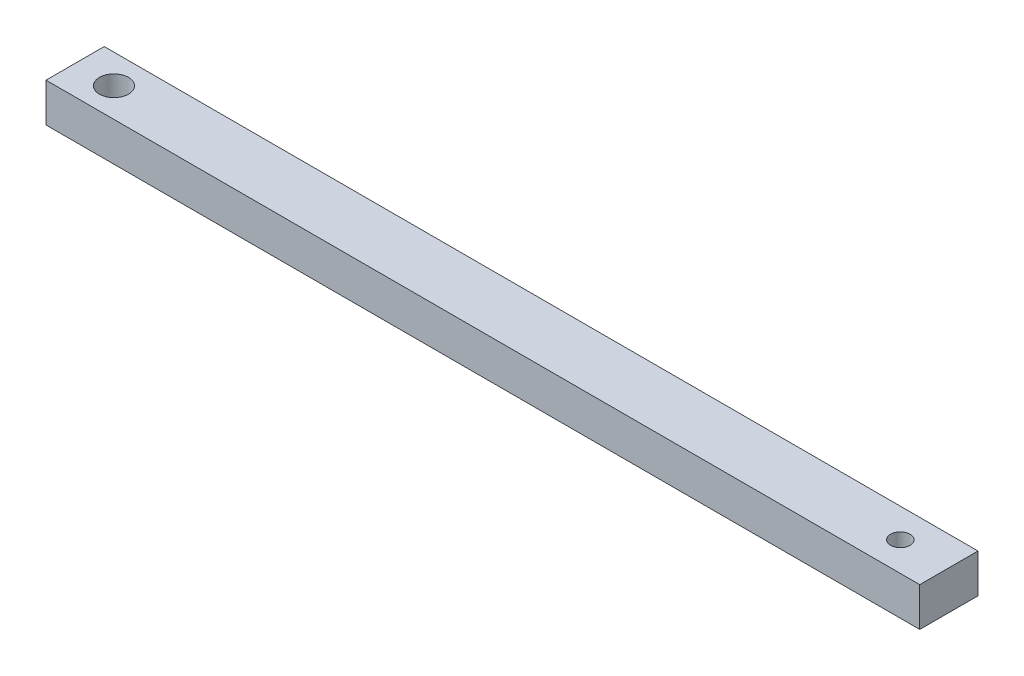
ISO-10303-21;
HEADER;
FILE_DESCRIPTION(('STEP AP214'),'2;1');
FILE_NAME('part.step','',(''),(''),'','','');
FILE_SCHEMA(('AUTOMOTIVE_DESIGN { 1 0 10303 214 1 1 1 1 }'));
ENDSEC;
DATA;
#1=APPLICATION_CONTEXT('core data for automotive mechanical design processes');
#2=APPLICATION_PROTOCOL_DEFINITION('international standard','automotive_design',2000,#1);
#3=PRODUCT_CONTEXT('',#1,'mechanical');
#4=PRODUCT('Part','Part','',(#3));
#5=PRODUCT_RELATED_PRODUCT_CATEGORY('part','',(#4));
#6=PRODUCT_DEFINITION_FORMATION('','',#4);
#7=PRODUCT_DEFINITION_CONTEXT('part definition',#1,'design');
#8=PRODUCT_DEFINITION('design','',#6,#7);
#9=PRODUCT_DEFINITION_SHAPE('','',#8);
#10=(LENGTH_UNIT() NAMED_UNIT(*) SI_UNIT(.MILLI.,.METRE.));
#11=(NAMED_UNIT(*) PLANE_ANGLE_UNIT() SI_UNIT($,.RADIAN.));
#12=(NAMED_UNIT(*) SI_UNIT($,.STERADIAN.) SOLID_ANGLE_UNIT());
#13=UNCERTAINTY_MEASURE_WITH_UNIT(LENGTH_MEASURE(1.E-05),#10,'distance_accuracy_value','');
#14=(GEOMETRIC_REPRESENTATION_CONTEXT(3) GLOBAL_UNCERTAINTY_ASSIGNED_CONTEXT((#13)) GLOBAL_UNIT_ASSIGNED_CONTEXT((#10,
#11,#12)) REPRESENTATION_CONTEXT('',''));
#15=CARTESIAN_POINT('',(0.,0.,0.));
#16=DIRECTION('',(0.,0.,1.));
#17=DIRECTION('',(1.,0.,0.));
#18=AXIS2_PLACEMENT_3D('',#15,#16,#17);
#19=CARTESIAN_POINT('',(225.,10.,30.));
#20=DIRECTION('',(-1.,0.,0.));
#21=DIRECTION('',(0.,0.,1.));
#22=AXIS2_PLACEMENT_3D('',#19,#20,#21);
#23=PLANE('',#22);
#24=DIRECTION('',(0.,1.,0.));
#25=VECTOR('',#24,1.);
#26=CARTESIAN_POINT('',(225.,10.,0.));
#27=LINE('',#26,#25);
#28=CARTESIAN_POINT('',(225.,-10.,0.));
#29=VERTEX_POINT('',#28);
#30=CARTESIAN_POINT('',(225.,10.,0.));
#31=VERTEX_POINT('',#30);
#32=EDGE_CURVE('E104',#29,#31,#27,.T.);
#33=ORIENTED_EDGE('',*,*,#32,.T.);
#34=DIRECTION('',(0.,0.,-1.));
#35=VECTOR('',#34,1.);
#36=CARTESIAN_POINT('',(225.,10.,30.));
#37=LINE('',#36,#35);
#38=CARTESIAN_POINT('',(225.,10.,30.));
#39=VERTEX_POINT('',#38);
#40=EDGE_CURVE('E11',#39,#31,#37,.T.);
#41=ORIENTED_EDGE('',*,*,#40,.F.);
#42=DIRECTION('',(0.,1.,0.));
#43=VECTOR('',#42,1.);
#44=CARTESIAN_POINT('',(225.,10.,30.));
#45=LINE('',#44,#43);
#46=CARTESIAN_POINT('',(225.,-10.,30.));
#47=VERTEX_POINT('',#46);
#48=EDGE_CURVE('E91',#47,#39,#45,.T.);
#49=ORIENTED_EDGE('',*,*,#48,.F.);
#50=DIRECTION('',(0.,0.,-1.));
#51=VECTOR('',#50,1.);
#52=CARTESIAN_POINT('',(225.,-10.,30.));
#53=LINE('',#52,#51);
#54=EDGE_CURVE('E100',#47,#29,#53,.T.);
#55=ORIENTED_EDGE('',*,*,#54,.T.);
#56=EDGE_LOOP('',(#33,#41,#49,#55));
#57=FACE_BOUND('',#56,.T.);
#58=ADVANCED_FACE('F39',(#57),#23,.F.);
#59=CARTESIAN_POINT('',(-225.,10.,30.));
#60=DIRECTION('',(0.,-1.,0.));
#61=DIRECTION('',(0.,0.,-1.));
#62=AXIS2_PLACEMENT_3D('',#59,#60,#61);
#63=PLANE('',#62);
#64=CARTESIAN_POINT('',(200.,10.,15.));
#65=DIRECTION('',(0.,1.,0.));
#66=DIRECTION('',(0.,0.,1.));
#67=AXIS2_PLACEMENT_3D('',#64,#65,#66);
#68=CIRCLE('',#67,4.99999999999999);
#69=CARTESIAN_POINT('',(200.,10.,20.));
#70=VERTEX_POINT('',#69);
#71=EDGE_CURVE('E121',#70,#70,#68,.T.);
#72=ORIENTED_EDGE('',*,*,#71,.F.);
#73=EDGE_LOOP('',(#72));
#74=FACE_BOUND('',#73,.T.);
#75=CARTESIAN_POINT('',(-205.,10.,15.));
#76=DIRECTION('',(0.,1.,0.));
#77=DIRECTION('',(0.,0.,1.));
#78=AXIS2_PLACEMENT_3D('',#75,#76,#77);
#79=CIRCLE('',#78,7.50000000000001);
#80=CARTESIAN_POINT('',(-205.,10.,22.5));
#81=VERTEX_POINT('',#80);
#82=EDGE_CURVE('E117',#81,#81,#79,.T.);
#83=ORIENTED_EDGE('',*,*,#82,.F.);
#84=EDGE_LOOP('',(#83));
#85=FACE_BOUND('',#84,.T.);
#86=DIRECTION('',(-1.,0.,0.));
#87=VECTOR('',#86,1.);
#88=CARTESIAN_POINT('',(-225.,10.,0.));
#89=LINE('',#88,#87);
#90=CARTESIAN_POINT('',(-225.,10.,0.));
#91=VERTEX_POINT('',#90);
#92=EDGE_CURVE('E95',#31,#91,#89,.T.);
#93=ORIENTED_EDGE('',*,*,#92,.T.);
#94=DIRECTION('',(0.,0.,-1.));
#95=VECTOR('',#94,1.);
#96=CARTESIAN_POINT('',(-225.,10.,30.));
#97=LINE('',#96,#95);
#98=CARTESIAN_POINT('',(-225.,10.,30.));
#99=VERTEX_POINT('',#98);
#100=EDGE_CURVE('E48',#99,#91,#97,.T.);
#101=ORIENTED_EDGE('',*,*,#100,.F.);
#102=DIRECTION('',(-1.,0.,0.));
#103=VECTOR('',#102,1.);
#104=CARTESIAN_POINT('',(-225.,10.,30.));
#105=LINE('',#104,#103);
#106=EDGE_CURVE('E86',#39,#99,#105,.T.);
#107=ORIENTED_EDGE('',*,*,#106,.F.);
#108=ORIENTED_EDGE('',*,*,#40,.T.);
#109=EDGE_LOOP('',(#93,#101,#107,#108));
#110=FACE_BOUND('',#109,.T.);
#111=ADVANCED_FACE('F94',(#74,#85,#110),#63,.F.);
#112=CARTESIAN_POINT('',(-225.,10.,30.));
#113=DIRECTION('',(1.,0.,0.));
#114=DIRECTION('',(0.,0.,-1.));
#115=AXIS2_PLACEMENT_3D('',#112,#113,#114);
#116=PLANE('',#115);
#117=DIRECTION('',(0.,-1.,0.));
#118=VECTOR('',#117,1.);
#119=CARTESIAN_POINT('',(-225.,10.,0.));
#120=LINE('',#119,#118);
#121=CARTESIAN_POINT('',(-225.,-10.,0.));
#122=VERTEX_POINT('',#121);
#123=EDGE_CURVE('E73',#91,#122,#120,.T.);
#124=ORIENTED_EDGE('',*,*,#123,.T.);
#125=DIRECTION('',(0.,0.,-1.));
#126=VECTOR('',#125,1.);
#127=CARTESIAN_POINT('',(-225.,-10.,30.));
#128=LINE('',#127,#126);
#129=CARTESIAN_POINT('',(-225.,-10.,30.));
#130=VERTEX_POINT('',#129);
#131=EDGE_CURVE('E96',#130,#122,#128,.T.);
#132=ORIENTED_EDGE('',*,*,#131,.F.);
#133=DIRECTION('',(0.,-1.,0.));
#134=VECTOR('',#133,1.);
#135=CARTESIAN_POINT('',(-225.,10.,30.));
#136=LINE('',#135,#134);
#137=EDGE_CURVE('E89',#99,#130,#136,.T.);
#138=ORIENTED_EDGE('',*,*,#137,.F.);
#139=ORIENTED_EDGE('',*,*,#100,.T.);
#140=EDGE_LOOP('',(#124,#132,#138,#139));
#141=FACE_BOUND('',#140,.T.);
#142=ADVANCED_FACE('F98',(#141),#116,.F.);
#143=CARTESIAN_POINT('',(-225.,-10.,30.));
#144=DIRECTION('',(0.,1.,0.));
#145=DIRECTION('',(0.,0.,1.));
#146=AXIS2_PLACEMENT_3D('',#143,#144,#145);
#147=PLANE('',#146);
#148=CARTESIAN_POINT('',(200.,-10.,15.));
#149=DIRECTION('',(0.,1.,0.));
#150=DIRECTION('',(0.,0.,1.));
#151=AXIS2_PLACEMENT_3D('',#148,#149,#150);
#152=CIRCLE('',#151,4.99999999999999);
#153=CARTESIAN_POINT('',(200.,-10.,20.));
#154=VERTEX_POINT('',#153);
#155=EDGE_CURVE('E120',#154,#154,#152,.T.);
#156=ORIENTED_EDGE('',*,*,#155,.T.);
#157=EDGE_LOOP('',(#156));
#158=FACE_BOUND('',#157,.T.);
#159=CARTESIAN_POINT('',(-205.,-10.,15.));
#160=DIRECTION('',(0.,1.,0.));
#161=DIRECTION('',(0.,0.,1.));
#162=AXIS2_PLACEMENT_3D('',#159,#160,#161);
#163=CIRCLE('',#162,7.50000000000001);
#164=CARTESIAN_POINT('',(-205.,-10.,22.5));
#165=VERTEX_POINT('',#164);
#166=EDGE_CURVE('E42',#165,#165,#163,.T.);
#167=ORIENTED_EDGE('',*,*,#166,.T.);
#168=EDGE_LOOP('',(#167));
#169=FACE_BOUND('',#168,.T.);
#170=DIRECTION('',(1.,0.,0.));
#171=VECTOR('',#170,1.);
#172=CARTESIAN_POINT('',(-225.,-10.,0.));
#173=LINE('',#172,#171);
#174=EDGE_CURVE('E79',#122,#29,#173,.T.);
#175=ORIENTED_EDGE('',*,*,#174,.T.);
#176=ORIENTED_EDGE('',*,*,#54,.F.);
#177=DIRECTION('',(1.,0.,0.));
#178=VECTOR('',#177,1.);
#179=CARTESIAN_POINT('',(-225.,-10.,30.));
#180=LINE('',#179,#178);
#181=EDGE_CURVE('E56',#130,#47,#180,.T.);
#182=ORIENTED_EDGE('',*,*,#181,.F.);
#183=ORIENTED_EDGE('',*,*,#131,.T.);
#184=EDGE_LOOP('',(#175,#176,#182,#183));
#185=FACE_BOUND('',#184,.T.);
#186=ADVANCED_FACE('F111',(#158,#169,#185),#147,.F.);
#187=CARTESIAN_POINT('',(0.,0.,30.));
#188=DIRECTION('',(0.,0.,1.));
#189=DIRECTION('',(1.,0.,0.));
#190=AXIS2_PLACEMENT_3D('',#187,#188,#189);
#191=PLANE('',#190);
#192=ORIENTED_EDGE('',*,*,#48,.T.);
#193=ORIENTED_EDGE('',*,*,#106,.T.);
#194=ORIENTED_EDGE('',*,*,#137,.T.);
#195=ORIENTED_EDGE('',*,*,#181,.T.);
#196=EDGE_LOOP('',(#192,#193,#194,#195));
#197=FACE_BOUND('',#196,.T.);
#198=ADVANCED_FACE('F87',(#197),#191,.T.);
#199=CARTESIAN_POINT('',(0.,0.,0.));
#200=DIRECTION('',(0.,0.,1.));
#201=DIRECTION('',(1.,0.,0.));
#202=AXIS2_PLACEMENT_3D('',#199,#200,#201);
#203=PLANE('',#202);
#204=ORIENTED_EDGE('',*,*,#32,.F.);
#205=ORIENTED_EDGE('',*,*,#174,.F.);
#206=ORIENTED_EDGE('',*,*,#123,.F.);
#207=ORIENTED_EDGE('',*,*,#92,.F.);
#208=EDGE_LOOP('',(#204,#205,#206,#207));
#209=FACE_BOUND('',#208,.T.);
#210=ADVANCED_FACE('F114',(#209),#203,.F.);
#211=CARTESIAN_POINT('',(-205.,-20.,15.));
#212=DIRECTION('',(0.,1.,0.));
#213=DIRECTION('',(0.,0.,1.));
#214=AXIS2_PLACEMENT_3D('',#211,#212,#213);
#215=CYLINDRICAL_SURFACE('',#214,7.50000000000001);
#216=ORIENTED_EDGE('',*,*,#82,.T.);
#217=EDGE_LOOP('',(#216));
#218=FACE_BOUND('',#217,.T.);
#219=ORIENTED_EDGE('',*,*,#166,.F.);
#220=EDGE_LOOP('',(#219));
#221=FACE_BOUND('',#220,.T.);
#222=ADVANCED_FACE('F132',(#218,#221),#215,.F.);
#223=CARTESIAN_POINT('',(200.,-10.,15.));
#224=DIRECTION('',(0.,1.,0.));
#225=DIRECTION('',(0.,0.,1.));
#226=AXIS2_PLACEMENT_3D('',#223,#224,#225);
#227=CYLINDRICAL_SURFACE('',#226,4.99999999999999);
#228=ORIENTED_EDGE('',*,*,#155,.F.);
#229=EDGE_LOOP('',(#228));
#230=FACE_BOUND('',#229,.T.);
#231=ORIENTED_EDGE('',*,*,#71,.T.);
#232=EDGE_LOOP('',(#231));
#233=FACE_BOUND('',#232,.T.);
#234=ADVANCED_FACE('F129',(#230,#233),#227,.F.);
#235=CLOSED_SHELL('',(#58,#111,#142,#186,#198,#210,#222,#234));
#236=MANIFOLD_SOLID_BREP('B2',#235);
#237=ADVANCED_BREP_SHAPE_REPRESENTATION('',(#18,#236),#14);
#238=SHAPE_DEFINITION_REPRESENTATION(#9,#237);
ENDSEC;
END-ISO-10303-21;
